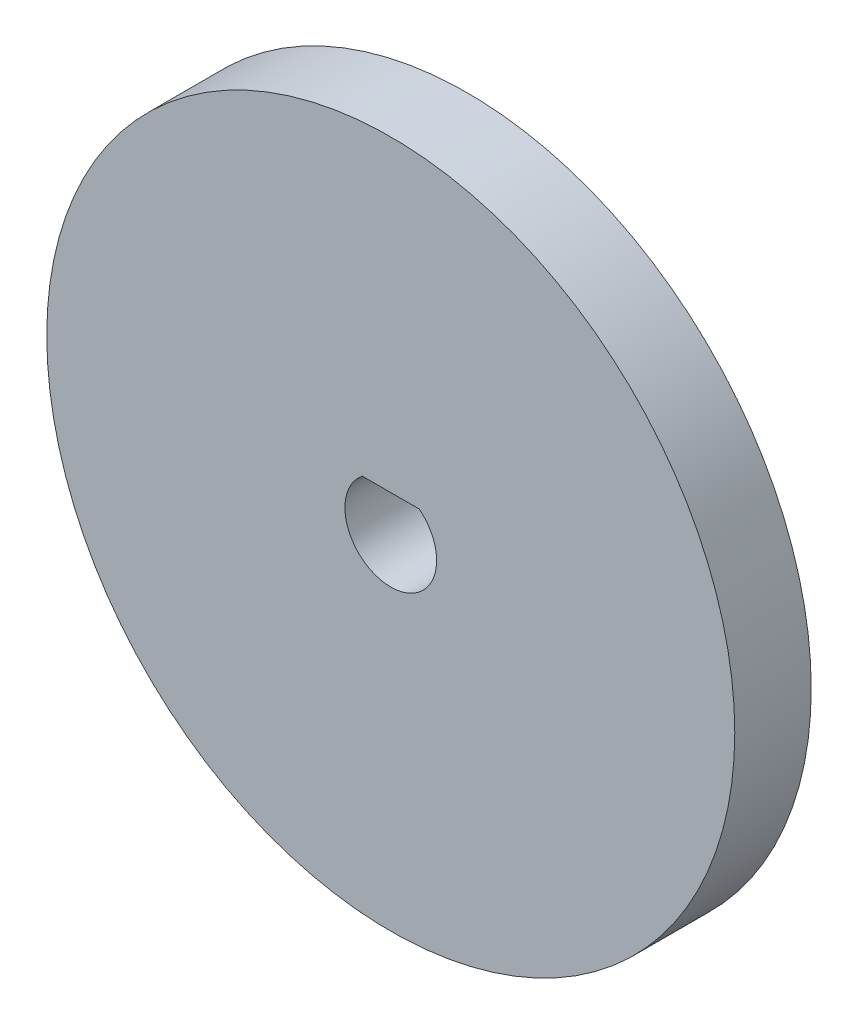
ISO-10303-21;
HEADER;
FILE_DESCRIPTION(('STEP AP214'),'2;1');
FILE_NAME('part.step','',(''),(''),'','','');
FILE_SCHEMA(('AUTOMOTIVE_DESIGN { 1 0 10303 214 1 1 1 1 }'));
ENDSEC;
DATA;
#1=APPLICATION_CONTEXT('core data for automotive mechanical design processes');
#2=APPLICATION_PROTOCOL_DEFINITION('international standard','automotive_design',2000,#1);
#3=PRODUCT_CONTEXT('',#1,'mechanical');
#4=PRODUCT('Part','Part','',(#3));
#5=PRODUCT_RELATED_PRODUCT_CATEGORY('part','',(#4));
#6=PRODUCT_DEFINITION_FORMATION('','',#4);
#7=PRODUCT_DEFINITION_CONTEXT('part definition',#1,'design');
#8=PRODUCT_DEFINITION('design','',#6,#7);
#9=PRODUCT_DEFINITION_SHAPE('','',#8);
#10=(LENGTH_UNIT() NAMED_UNIT(*) SI_UNIT(.MILLI.,.METRE.));
#11=(NAMED_UNIT(*) PLANE_ANGLE_UNIT() SI_UNIT($,.RADIAN.));
#12=(NAMED_UNIT(*) SI_UNIT($,.STERADIAN.) SOLID_ANGLE_UNIT());
#13=UNCERTAINTY_MEASURE_WITH_UNIT(LENGTH_MEASURE(1.E-05),#10,'distance_accuracy_value','');
#14=(GEOMETRIC_REPRESENTATION_CONTEXT(3) GLOBAL_UNCERTAINTY_ASSIGNED_CONTEXT((#13)) GLOBAL_UNIT_ASSIGNED_CONTEXT((#10,
#11,#12)) REPRESENTATION_CONTEXT('',''));
#15=CARTESIAN_POINT('',(0.,0.,0.));
#16=DIRECTION('',(0.,0.,1.));
#17=DIRECTION('',(1.,0.,0.));
#18=AXIS2_PLACEMENT_3D('',#15,#16,#17);
#19=CARTESIAN_POINT('',(0.,0.,5.));
#20=DIRECTION('',(0.,0.,-1.));
#21=DIRECTION('',(-1.,0.,0.));
#22=AXIS2_PLACEMENT_3D('',#19,#20,#21);
#23=CYLINDRICAL_SURFACE('',#22,3.);
#24=CARTESIAN_POINT('',(0.,0.,0.));
#25=DIRECTION('',(0.,0.,1.));
#26=DIRECTION('',(1.,0.,0.));
#27=AXIS2_PLACEMENT_3D('',#24,#25,#26);
#28=CIRCLE('',#27,3.);
#29=CARTESIAN_POINT('',(-1.86480561989715,2.35,0.));
#30=VERTEX_POINT('',#29);
#31=CARTESIAN_POINT('',(1.86480561989715,2.35,0.));
#32=VERTEX_POINT('',#31);
#33=EDGE_CURVE('E65',#30,#32,#28,.T.);
#34=ORIENTED_EDGE('',*,*,#33,.F.);
#35=DIRECTION('',(0.,0.,-1.));
#36=VECTOR('',#35,1.);
#37=CARTESIAN_POINT('',(-1.86480561989715,2.35,5.));
#38=LINE('',#37,#36);
#39=CARTESIAN_POINT('',(-1.86480561989715,2.35,5.));
#40=VERTEX_POINT('',#39);
#41=EDGE_CURVE('E11',#40,#30,#38,.T.);
#42=ORIENTED_EDGE('',*,*,#41,.F.);
#43=CARTESIAN_POINT('',(0.,0.,5.));
#44=DIRECTION('',(0.,0.,1.));
#45=DIRECTION('',(1.,0.,0.));
#46=AXIS2_PLACEMENT_3D('',#43,#44,#45);
#47=CIRCLE('',#46,3.);
#48=CARTESIAN_POINT('',(1.86480561989715,2.35,5.));
#49=VERTEX_POINT('',#48);
#50=EDGE_CURVE('E66',#40,#49,#47,.T.);
#51=ORIENTED_EDGE('',*,*,#50,.T.);
#52=DIRECTION('',(0.,0.,-1.));
#53=VECTOR('',#52,1.);
#54=CARTESIAN_POINT('',(1.86480561989715,2.35,5.));
#55=LINE('',#54,#53);
#56=EDGE_CURVE('E45',#49,#32,#55,.T.);
#57=ORIENTED_EDGE('',*,*,#56,.T.);
#58=EDGE_LOOP('',(#34,#42,#51,#57));
#59=FACE_BOUND('',#58,.T.);
#60=ADVANCED_FACE('F37',(#59),#23,.F.);
#61=CARTESIAN_POINT('',(0.,2.35,5.));
#62=DIRECTION('',(0.,1.,0.));
#63=DIRECTION('',(0.,0.,1.));
#64=AXIS2_PLACEMENT_3D('',#61,#62,#63);
#65=PLANE('',#64);
#66=DIRECTION('',(1.,0.,0.));
#67=VECTOR('',#66,1.);
#68=CARTESIAN_POINT('',(0.,2.35,0.));
#69=LINE('',#68,#67);
#70=EDGE_CURVE('E68',#30,#32,#69,.T.);
#71=ORIENTED_EDGE('',*,*,#70,.T.);
#72=ORIENTED_EDGE('',*,*,#56,.F.);
#73=DIRECTION('',(1.,0.,0.));
#74=VECTOR('',#73,1.);
#75=CARTESIAN_POINT('',(0.,2.35,5.));
#76=LINE('',#75,#74);
#77=EDGE_CURVE('E52',#40,#49,#76,.T.);
#78=ORIENTED_EDGE('',*,*,#77,.F.);
#79=ORIENTED_EDGE('',*,*,#41,.T.);
#80=EDGE_LOOP('',(#71,#72,#78,#79));
#81=FACE_BOUND('',#80,.T.);
#82=ADVANCED_FACE('F69',(#81),#65,.F.);
#83=CARTESIAN_POINT('',(0.,0.,5.));
#84=DIRECTION('',(0.,0.,-1.));
#85=DIRECTION('',(-1.,0.,0.));
#86=AXIS2_PLACEMENT_3D('',#83,#84,#85);
#87=CYLINDRICAL_SURFACE('',#86,22.5);
#88=CARTESIAN_POINT('',(0.,0.,5.));
#89=DIRECTION('',(0.,0.,1.));
#90=DIRECTION('',(1.,0.,0.));
#91=AXIS2_PLACEMENT_3D('',#88,#89,#90);
#92=CIRCLE('',#91,22.5);
#93=CARTESIAN_POINT('',(22.5,0.,5.));
#94=VERTEX_POINT('',#93);
#95=EDGE_CURVE('E67',#94,#94,#92,.T.);
#96=ORIENTED_EDGE('',*,*,#95,.F.);
#97=EDGE_LOOP('',(#96));
#98=FACE_BOUND('',#97,.T.);
#99=CARTESIAN_POINT('',(0.,0.,0.));
#100=DIRECTION('',(0.,0.,1.));
#101=DIRECTION('',(1.,0.,0.));
#102=AXIS2_PLACEMENT_3D('',#99,#100,#101);
#103=CIRCLE('',#102,22.5);
#104=CARTESIAN_POINT('',(22.5,0.,0.));
#105=VERTEX_POINT('',#104);
#106=EDGE_CURVE('E71',#105,#105,#103,.T.);
#107=ORIENTED_EDGE('',*,*,#106,.T.);
#108=EDGE_LOOP('',(#107));
#109=FACE_BOUND('',#108,.T.);
#110=ADVANCED_FACE('F88',(#98,#109),#87,.T.);
#111=CARTESIAN_POINT('',(0.,0.,5.));
#112=DIRECTION('',(0.,0.,1.));
#113=DIRECTION('',(1.,0.,0.));
#114=AXIS2_PLACEMENT_3D('',#111,#112,#113);
#115=PLANE('',#114);
#116=ORIENTED_EDGE('',*,*,#50,.F.);
#117=ORIENTED_EDGE('',*,*,#77,.T.);
#118=EDGE_LOOP('',(#116,#117));
#119=FACE_BOUND('',#118,.T.);
#120=ORIENTED_EDGE('',*,*,#95,.T.);
#121=EDGE_LOOP('',(#120));
#122=FACE_BOUND('',#121,.T.);
#123=ADVANCED_FACE('F86',(#119,#122),#115,.T.);
#124=CARTESIAN_POINT('',(0.,0.,0.));
#125=DIRECTION('',(0.,0.,1.));
#126=DIRECTION('',(1.,0.,0.));
#127=AXIS2_PLACEMENT_3D('',#124,#125,#126);
#128=PLANE('',#127);
#129=ORIENTED_EDGE('',*,*,#33,.T.);
#130=ORIENTED_EDGE('',*,*,#70,.F.);
#131=EDGE_LOOP('',(#129,#130));
#132=FACE_BOUND('',#131,.T.);
#133=ORIENTED_EDGE('',*,*,#106,.F.);
#134=EDGE_LOOP('',(#133));
#135=FACE_BOUND('',#134,.T.);
#136=ADVANCED_FACE('F73',(#132,#135),#128,.F.);
#137=CLOSED_SHELL('',(#60,#82,#110,#123,#136));
#138=MANIFOLD_SOLID_BREP('B2',#137);
#139=ADVANCED_BREP_SHAPE_REPRESENTATION('',(#18,#138),#14);
#140=SHAPE_DEFINITION_REPRESENTATION(#9,#139);
ENDSEC;
END-ISO-10303-21;
